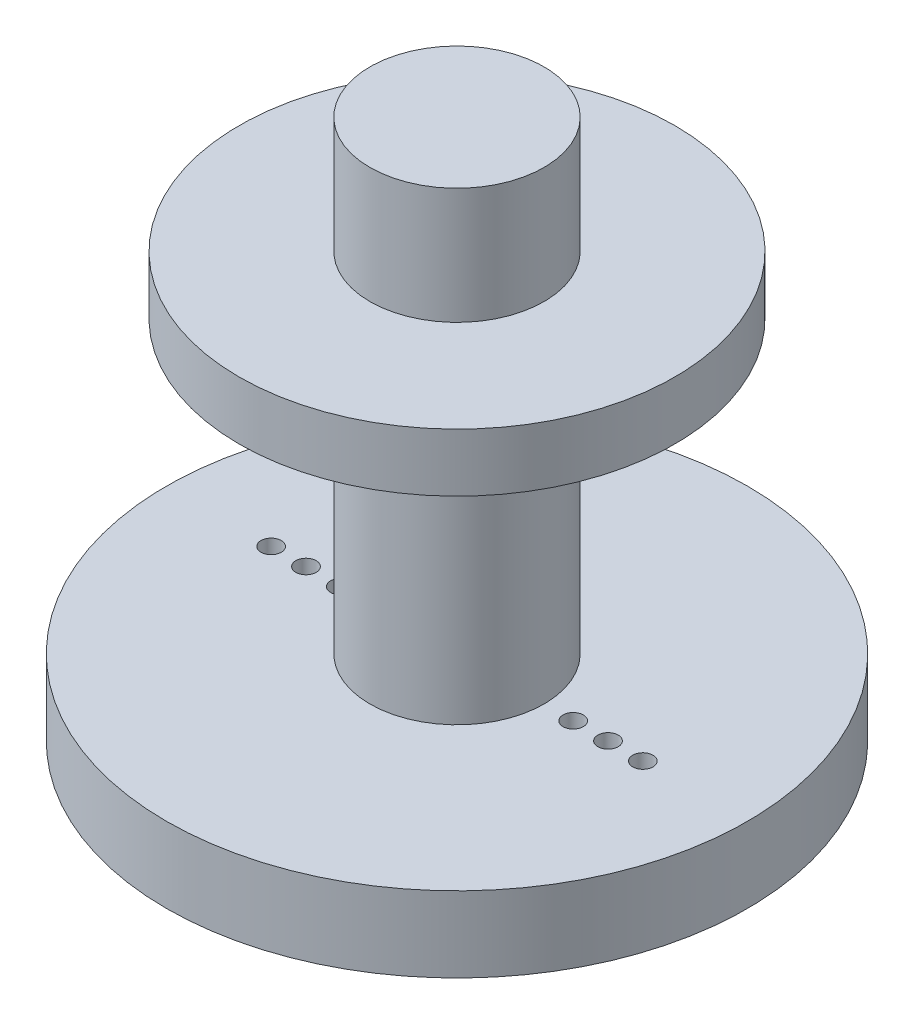
ISO-10303-21;
HEADER;
FILE_DESCRIPTION(('STEP AP214'),'2;1');
FILE_NAME('part.step','',(''),(''),'','','');
FILE_SCHEMA(('AUTOMOTIVE_DESIGN { 1 0 10303 214 1 1 1 1 }'));
ENDSEC;
DATA;
#1=APPLICATION_CONTEXT('core data for automotive mechanical design processes');
#2=APPLICATION_PROTOCOL_DEFINITION('international standard','automotive_design',2000,#1);
#3=PRODUCT_CONTEXT('',#1,'mechanical');
#4=PRODUCT('Part','Part','',(#3));
#5=PRODUCT_RELATED_PRODUCT_CATEGORY('part','',(#4));
#6=PRODUCT_DEFINITION_FORMATION('','',#4);
#7=PRODUCT_DEFINITION_CONTEXT('part definition',#1,'design');
#8=PRODUCT_DEFINITION('design','',#6,#7);
#9=PRODUCT_DEFINITION_SHAPE('','',#8);
#10=(LENGTH_UNIT() NAMED_UNIT(*) SI_UNIT(.MILLI.,.METRE.));
#11=(NAMED_UNIT(*) PLANE_ANGLE_UNIT() SI_UNIT($,.RADIAN.));
#12=(NAMED_UNIT(*) SI_UNIT($,.STERADIAN.) SOLID_ANGLE_UNIT());
#13=UNCERTAINTY_MEASURE_WITH_UNIT(LENGTH_MEASURE(1.E-05),#10,'distance_accuracy_value','');
#14=(GEOMETRIC_REPRESENTATION_CONTEXT(3) GLOBAL_UNCERTAINTY_ASSIGNED_CONTEXT((#13)) GLOBAL_UNIT_ASSIGNED_CONTEXT((#10,
#11,#12)) REPRESENTATION_CONTEXT('',''));
#15=CARTESIAN_POINT('',(0.,0.,0.));
#16=DIRECTION('',(0.,0.,1.));
#17=DIRECTION('',(1.,0.,0.));
#18=AXIS2_PLACEMENT_3D('',#15,#16,#17);
#19=CARTESIAN_POINT('',(0.,6.5,0.));
#20=DIRECTION('',(0.,-1.,0.));
#21=DIRECTION('',(0.,0.,-1.));
#22=AXIS2_PLACEMENT_3D('',#19,#20,#21);
#23=CYLINDRICAL_SURFACE('',#22,25.);
#24=CARTESIAN_POINT('',(0.,6.5,0.));
#25=DIRECTION('',(0.,1.,0.));
#26=DIRECTION('',(0.,0.,1.));
#27=AXIS2_PLACEMENT_3D('',#24,#25,#26);
#28=CIRCLE('',#27,25.);
#29=CARTESIAN_POINT('',(0.,6.5,-25.));
#30=VERTEX_POINT('',#29);
#31=EDGE_CURVE('E46',#30,#30,#28,.T.);
#32=CARTESIAN_POINT('',(0.,0.,0.));
#33=DIRECTION('',(0.,1.,0.));
#34=DIRECTION('',(0.,0.,1.));
#35=AXIS2_PLACEMENT_3D('',#32,#33,#34);
#36=CIRCLE('',#35,25.);
#37=CARTESIAN_POINT('',(0.,0.,-25.));
#38=VERTEX_POINT('',#37);
#39=EDGE_CURVE('E41',#38,#38,#36,.T.);
#40=CARTESIAN_POINT('',(0.,6.5,-25.));
#41=CARTESIAN_POINT('',(0.,6.43229166666667,-25.));
#42=CARTESIAN_POINT('',(0.,6.36458333333333,-25.));
#43=CARTESIAN_POINT('',(0.,6.22916666666667,-25.));
#44=CARTESIAN_POINT('',(0.,6.16145833333333,-25.));
#45=CARTESIAN_POINT('',(0.,6.02604166666667,-25.));
#46=CARTESIAN_POINT('',(0.,5.95833333333333,-25.));
#47=CARTESIAN_POINT('',(0.,5.82291666666667,-25.));
#48=CARTESIAN_POINT('',(0.,5.75520833333333,-25.));
#49=CARTESIAN_POINT('',(0.,5.61979166666667,-25.));
#50=CARTESIAN_POINT('',(0.,5.55208333333333,-25.));
#51=CARTESIAN_POINT('',(0.,5.41666666666667,-25.));
#52=CARTESIAN_POINT('',(0.,5.34895833333333,-25.));
#53=CARTESIAN_POINT('',(0.,5.21354166666667,-25.));
#54=CARTESIAN_POINT('',(0.,5.14583333333333,-25.));
#55=CARTESIAN_POINT('',(0.,5.01041666666667,-25.));
#56=CARTESIAN_POINT('',(0.,4.94270833333333,-25.));
#57=CARTESIAN_POINT('',(0.,4.80729166666667,-25.));
#58=CARTESIAN_POINT('',(0.,4.73958333333333,-25.));
#59=CARTESIAN_POINT('',(0.,4.60416666666667,-25.));
#60=CARTESIAN_POINT('',(0.,4.53645833333333,-25.));
#61=CARTESIAN_POINT('',(0.,4.40104166666667,-25.));
#62=CARTESIAN_POINT('',(0.,4.33333333333333,-25.));
#63=CARTESIAN_POINT('',(0.,4.19791666666667,-25.));
#64=CARTESIAN_POINT('',(0.,4.13020833333333,-25.));
#65=CARTESIAN_POINT('',(0.,3.99479166666667,-25.));
#66=CARTESIAN_POINT('',(0.,3.92708333333333,-25.));
#67=CARTESIAN_POINT('',(0.,3.79166666666667,-25.));
#68=CARTESIAN_POINT('',(0.,3.72395833333333,-25.));
#69=CARTESIAN_POINT('',(0.,3.58854166666667,-25.));
#70=CARTESIAN_POINT('',(0.,3.52083333333333,-25.));
#71=CARTESIAN_POINT('',(0.,3.38541666666667,-25.));
#72=CARTESIAN_POINT('',(0.,3.31770833333333,-25.));
#73=CARTESIAN_POINT('',(0.,3.18229166666667,-25.));
#74=CARTESIAN_POINT('',(0.,3.11458333333333,-25.));
#75=CARTESIAN_POINT('',(0.,2.97916666666667,-25.));
#76=CARTESIAN_POINT('',(0.,2.91145833333333,-25.));
#77=CARTESIAN_POINT('',(0.,2.77604166666667,-25.));
#78=CARTESIAN_POINT('',(0.,2.70833333333333,-25.));
#79=CARTESIAN_POINT('',(0.,2.57291666666667,-25.));
#80=CARTESIAN_POINT('',(0.,2.50520833333333,-25.));
#81=CARTESIAN_POINT('',(0.,2.36979166666667,-25.));
#82=CARTESIAN_POINT('',(0.,2.30208333333333,-25.));
#83=CARTESIAN_POINT('',(0.,2.16666666666667,-25.));
#84=CARTESIAN_POINT('',(0.,2.09895833333333,-25.));
#85=CARTESIAN_POINT('',(0.,1.96354166666667,-25.));
#86=CARTESIAN_POINT('',(0.,1.89583333333333,-25.));
#87=CARTESIAN_POINT('',(0.,1.76041666666667,-25.));
#88=CARTESIAN_POINT('',(0.,1.69270833333333,-25.));
#89=CARTESIAN_POINT('',(0.,1.55729166666667,-25.));
#90=CARTESIAN_POINT('',(0.,1.48958333333333,-25.));
#91=CARTESIAN_POINT('',(0.,1.35416666666667,-25.));
#92=CARTESIAN_POINT('',(0.,1.28645833333333,-25.));
#93=CARTESIAN_POINT('',(0.,1.15104166666667,-25.));
#94=CARTESIAN_POINT('',(0.,1.08333333333333,-25.));
#95=CARTESIAN_POINT('',(0.,0.947916666666667,-25.));
#96=CARTESIAN_POINT('',(0.,0.880208333333333,-25.));
#97=CARTESIAN_POINT('',(0.,0.744791666666667,-25.));
#98=CARTESIAN_POINT('',(0.,0.677083333333333,-25.));
#99=CARTESIAN_POINT('',(0.,0.541666666666667,-25.));
#100=CARTESIAN_POINT('',(0.,0.473958333333333,-25.));
#101=CARTESIAN_POINT('',(0.,0.338541666666667,-25.));
#102=CARTESIAN_POINT('',(0.,0.270833333333334,-25.));
#103=CARTESIAN_POINT('',(0.,0.135416666666667,-25.));
#104=CARTESIAN_POINT('',(0.,0.0677083333333334,-25.));
#105=CARTESIAN_POINT('',(0.,0.,-25.));
#106=B_SPLINE_CURVE_WITH_KNOTS('',3,(#40,#41,#42,#43,#44,#45,#46,#47,#48,#49,#50,#51,#52,#53,
#54,#55,#56,#57,#58,#59,#60,#61,#62,#63,#64,#65,#66,#67,#68,#69,#70,#71,#72,#73,#74,#75,#76,#77,
#78,#79,#80,#81,#82,#83,#84,#85,#86,#87,#88,#89,#90,#91,#92,#93,#94,#95,#96,#97,#98,#99,#100,
#101,#102,#103,#104,#105),.UNSPECIFIED.,.F.,.F.,(4,2,2,2,2,2,2,2,2,2,2,2,2,2,2,2,2,2,2,2,2,2,2,
2,2,2,2,2,2,2,2,2,4),(0.,0.203125,0.40625,0.609375000000001,0.812500000000001,1.015625,1.21875,
1.421875,1.625,1.828125,2.03125,2.234375,2.4375,2.640625,2.84375,3.046875,3.25,3.453125,3.65625,
3.859375,4.0625,4.265625,4.46875,4.671875,4.875,5.078125,5.28125,5.484375,5.6875,5.890625,
6.09375,6.296875,6.5),.UNSPECIFIED.);
#107=EDGE_CURVE('BSEAM38',#30,#38,#106,.T.);
#108=ORIENTED_EDGE('',*,*,#31,.F.);
#109=ORIENTED_EDGE('',*,*,#39,.T.);
#110=ORIENTED_EDGE('',*,*,#107,.T.);
#111=ORIENTED_EDGE('',*,*,#107,.F.);
#112=EDGE_LOOP('',(#108,#110,#109,#111));
#113=FACE_BOUND('',#112,.T.);
#114=ADVANCED_FACE('F38',(#113),#23,.T.);
#115=CARTESIAN_POINT('',(0.,6.5,0.));
#116=DIRECTION('',(0.,1.,0.));
#117=DIRECTION('',(0.,0.,1.));
#118=AXIS2_PLACEMENT_3D('',#115,#116,#117);
#119=PLANE('',#118);
#120=CARTESIAN_POINT('',(0.,6.5,0.));
#121=DIRECTION('',(0.,1.,0.));
#122=DIRECTION('',(0.,0.,1.));
#123=AXIS2_PLACEMENT_3D('',#120,#121,#122);
#124=CIRCLE('',#123,7.5);
#125=CARTESIAN_POINT('',(0.,6.5,7.5));
#126=VERTEX_POINT('',#125);
#127=EDGE_CURVE('E506',#126,#126,#124,.T.);
#128=ORIENTED_EDGE('',*,*,#127,.F.);
#129=EDGE_LOOP('',(#128));
#130=FACE_BOUND('',#129,.T.);
#131=CARTESIAN_POINT('',(-16.,6.5,0.));
#132=DIRECTION('',(0.,1.,0.));
#133=DIRECTION('',(0.,0.,1.));
#134=AXIS2_PLACEMENT_3D('',#131,#132,#133);
#135=CIRCLE('',#134,0.875);
#136=CARTESIAN_POINT('',(-16.,6.5,0.875));
#137=VERTEX_POINT('',#136);
#138=EDGE_CURVE('E476',#137,#137,#135,.F.);
#139=ORIENTED_EDGE('',*,*,#138,.T.);
#140=EDGE_LOOP('',(#139));
#141=FACE_BOUND('',#140,.T.);
#142=CARTESIAN_POINT('',(-13.,6.5,0.));
#143=DIRECTION('',(0.,1.,0.));
#144=DIRECTION('',(0.,0.,1.));
#145=AXIS2_PLACEMENT_3D('',#142,#143,#144);
#146=CIRCLE('',#145,0.875);
#147=CARTESIAN_POINT('',(-13.,6.5,0.875));
#148=VERTEX_POINT('',#147);
#149=EDGE_CURVE('E483',#148,#148,#146,.F.);
#150=ORIENTED_EDGE('',*,*,#149,.T.);
#151=EDGE_LOOP('',(#150));
#152=FACE_BOUND('',#151,.T.);
#153=CARTESIAN_POINT('',(-10.,6.5,0.));
#154=DIRECTION('',(0.,1.,0.));
#155=DIRECTION('',(0.,0.,1.));
#156=AXIS2_PLACEMENT_3D('',#153,#154,#155);
#157=CIRCLE('',#156,0.875);
#158=CARTESIAN_POINT('',(-10.,6.5,0.875));
#159=VERTEX_POINT('',#158);
#160=EDGE_CURVE('E489',#159,#159,#157,.F.);
#161=ORIENTED_EDGE('',*,*,#160,.T.);
#162=EDGE_LOOP('',(#161));
#163=FACE_BOUND('',#162,.T.);
#164=CARTESIAN_POINT('',(16.,6.5,0.));
#165=DIRECTION('',(0.,1.,0.));
#166=DIRECTION('',(0.,0.,1.));
#167=AXIS2_PLACEMENT_3D('',#164,#165,#166);
#168=CIRCLE('',#167,0.875000000000002);
#169=CARTESIAN_POINT('',(16.,6.5,0.875000000000002));
#170=VERTEX_POINT('',#169);
#171=EDGE_CURVE('E495',#170,#170,#168,.F.);
#172=ORIENTED_EDGE('',*,*,#171,.T.);
#173=EDGE_LOOP('',(#172));
#174=FACE_BOUND('',#173,.T.);
#175=CARTESIAN_POINT('',(13.,6.5,0.));
#176=DIRECTION('',(0.,1.,0.));
#177=DIRECTION('',(0.,0.,1.));
#178=AXIS2_PLACEMENT_3D('',#175,#176,#177);
#179=CIRCLE('',#178,0.875);
#180=CARTESIAN_POINT('',(13.,6.5,0.875));
#181=VERTEX_POINT('',#180);
#182=EDGE_CURVE('E501',#181,#181,#179,.F.);
#183=ORIENTED_EDGE('',*,*,#182,.T.);
#184=EDGE_LOOP('',(#183));
#185=FACE_BOUND('',#184,.T.);
#186=CARTESIAN_POINT('',(10.,6.5,0.));
#187=DIRECTION('',(0.,1.,0.));
#188=DIRECTION('',(0.,0.,1.));
#189=AXIS2_PLACEMENT_3D('',#186,#187,#188);
#190=CIRCLE('',#189,0.875);
#191=CARTESIAN_POINT('',(10.,6.5,0.875));
#192=VERTEX_POINT('',#191);
#193=EDGE_CURVE('E470',#192,#192,#190,.F.);
#194=ORIENTED_EDGE('',*,*,#193,.T.);
#195=EDGE_LOOP('',(#194));
#196=FACE_BOUND('',#195,.T.);
#197=ORIENTED_EDGE('',*,*,#31,.T.);
#198=EDGE_LOOP('',(#197));
#199=FACE_BOUND('',#198,.T.);
#200=ADVANCED_FACE('F244',(#130,#141,#152,#163,#174,#185,#196,#199),#119,.T.);
#201=CARTESIAN_POINT('',(0.,0.,0.));
#202=DIRECTION('',(0.,1.,0.));
#203=DIRECTION('',(0.,0.,1.));
#204=AXIS2_PLACEMENT_3D('',#201,#202,#203);
#205=PLANE('',#204);
#206=CARTESIAN_POINT('',(17.8847290850349,0.,-0.56107491716859));
#207=DIRECTION('',(0.,-1.,0.));
#208=DIRECTION('',(0.,0.,1.));
#209=AXIS2_PLACEMENT_3D('',#206,#207,#208);
#210=CIRCLE('',#209,3.11643938542762);
#211=CARTESIAN_POINT('',(21.,0.,-0.475742804709889));
#212=VERTEX_POINT('',#211);
#213=CARTESIAN_POINT('',(17.4455022656401,0.,2.52425719529011));
#214=VERTEX_POINT('',#213);
#215=EDGE_CURVE('E176',#212,#214,#210,.T.);
#216=ORIENTED_EDGE('',*,*,#215,.F.);
#217=CARTESIAN_POINT('',(18.0512468769501,0.,0.53274589743214));
#218=DIRECTION('',(0.,-1.,0.));
#219=DIRECTION('',(0.,0.,-1.));
#220=AXIS2_PLACEMENT_3D('',#217,#218,#219);
#221=CIRCLE('',#220,3.11643938542762);
#222=CARTESIAN_POINT('',(17.4455022656401,0.,-2.52425719529011));
#223=VERTEX_POINT('',#222);
#224=EDGE_CURVE('E54',#223,#212,#221,.T.);
#225=ORIENTED_EDGE('',*,*,#224,.F.);
#226=CARTESIAN_POINT('',(-5.20599883220902,0.,108.70856155673));
#227=DIRECTION('',(0.,-1.,0.));
#228=DIRECTION('',(0.,0.,-1.));
#229=AXIS2_PLACEMENT_3D('',#226,#227,#228);
#230=CIRCLE('',#229,113.51577189759);
#231=CARTESIAN_POINT('',(8.10347319825868,0.,-4.02425719529009));
#232=VERTEX_POINT('',#231);
#233=EDGE_CURVE('E210',#232,#223,#230,.T.);
#234=ORIENTED_EDGE('',*,*,#233,.F.);
#235=CARTESIAN_POINT('',(-3.64270437307683,0.,16.0686571908747));
#236=DIRECTION('',(0.,-1.,0.));
#237=DIRECTION('',(0.,0.,-1.));
#238=AXIS2_PLACEMENT_3D('',#235,#236,#237);
#239=CIRCLE('',#238,23.2744043117561);
#240=CARTESIAN_POINT('',(2.86783245125889,0.,-6.27660643088779));
#241=VERTEX_POINT('',#240);
#242=EDGE_CURVE('E208',#241,#232,#239,.T.);
#243=ORIENTED_EDGE('',*,*,#242,.F.);
#244=CARTESIAN_POINT('',(0.,0.,0.));
#245=DIRECTION('',(0.,-1.,0.));
#246=DIRECTION('',(0.,0.,-1.));
#247=AXIS2_PLACEMENT_3D('',#244,#245,#246);
#248=CIRCLE('',#247,6.90074280470991);
#249=CARTESIAN_POINT('',(-2.86783245125889,0.,-6.2766064308878));
#250=VERTEX_POINT('',#249);
#251=EDGE_CURVE('E150',#250,#241,#248,.T.);
#252=ORIENTED_EDGE('',*,*,#251,.F.);
#253=CARTESIAN_POINT('',(3.64270437307683,0.,16.0686571908747));
#254=DIRECTION('',(0.,-1.,0.));
#255=DIRECTION('',(0.,0.,1.));
#256=AXIS2_PLACEMENT_3D('',#253,#254,#255);
#257=CIRCLE('',#256,23.2744043117561);
#258=CARTESIAN_POINT('',(-8.10347319825866,0.,-4.02425719529009));
#259=VERTEX_POINT('',#258);
#260=EDGE_CURVE('E204',#259,#250,#257,.T.);
#261=ORIENTED_EDGE('',*,*,#260,.F.);
#262=CARTESIAN_POINT('',(-6.12655750670442,0.,109.474299068013));
#263=DIRECTION('',(0.,-1.,0.));
#264=DIRECTION('',(0.,0.,1.));
#265=AXIS2_PLACEMENT_3D('',#262,#263,#264);
#266=CIRCLE('',#265,113.51577189759);
#267=CARTESIAN_POINT('',(-17.4455022656401,0.,-3.47574280470989));
#268=VERTEX_POINT('',#267);
#269=EDGE_CURVE('E201',#268,#259,#266,.T.);
#270=ORIENTED_EDGE('',*,*,#269,.F.);
#271=CARTESIAN_POINT('',(-17.8847290850349,0.,-0.390410692251189));
#272=DIRECTION('',(0.,-1.,0.));
#273=DIRECTION('',(0.,0.,1.));
#274=AXIS2_PLACEMENT_3D('',#271,#272,#273);
#275=CIRCLE('',#274,3.11643938542762);
#276=CARTESIAN_POINT('',(-21.,0.,-0.475742804709896));
#277=VERTEX_POINT('',#276);
#278=EDGE_CURVE('E198',#277,#268,#275,.T.);
#279=ORIENTED_EDGE('',*,*,#278,.F.);
#280=CARTESIAN_POINT('',(-17.8847290850349,0.,-0.561074917168592));
#281=DIRECTION('',(0.,-1.,0.));
#282=DIRECTION('',(0.,0.,-1.));
#283=AXIS2_PLACEMENT_3D('',#280,#281,#282);
#284=CIRCLE('',#283,3.11643938542762);
#285=CARTESIAN_POINT('',(-17.4455022656401,0.,2.52425719529011));
#286=VERTEX_POINT('',#285);
#287=EDGE_CURVE('E195',#286,#277,#284,.T.);
#288=ORIENTED_EDGE('',*,*,#287,.F.);
#289=CARTESIAN_POINT('',(5.20599883220902,0.,-108.70856155673));
#290=DIRECTION('',(0.,-1.,0.));
#291=DIRECTION('',(0.,0.,-1.));
#292=AXIS2_PLACEMENT_3D('',#289,#290,#291);
#293=CIRCLE('',#292,113.51577189759);
#294=CARTESIAN_POINT('',(-8.10347319825867,0.,4.0242571952901));
#295=VERTEX_POINT('',#294);
#296=EDGE_CURVE('E192',#295,#286,#293,.T.);
#297=ORIENTED_EDGE('',*,*,#296,.F.);
#298=CARTESIAN_POINT('',(3.64270437307683,0.,-16.0686571908747));
#299=DIRECTION('',(0.,-1.,0.));
#300=DIRECTION('',(0.,0.,-1.));
#301=AXIS2_PLACEMENT_3D('',#298,#299,#300);
#302=CIRCLE('',#301,23.2744043117561);
#303=CARTESIAN_POINT('',(-2.86783245125889,0.,6.2766064308878));
#304=VERTEX_POINT('',#303);
#305=EDGE_CURVE('E189',#304,#295,#302,.T.);
#306=ORIENTED_EDGE('',*,*,#305,.F.);
#307=CARTESIAN_POINT('',(0.,0.,0.));
#308=DIRECTION('',(0.,-1.,0.));
#309=DIRECTION('',(0.,0.,-1.));
#310=AXIS2_PLACEMENT_3D('',#307,#308,#309);
#311=CIRCLE('',#310,6.90074280470991);
#312=CARTESIAN_POINT('',(2.86783245125889,0.,6.27660643088779));
#313=VERTEX_POINT('',#312);
#314=EDGE_CURVE('E186',#313,#304,#311,.T.);
#315=ORIENTED_EDGE('',*,*,#314,.F.);
#316=CARTESIAN_POINT('',(-3.64270437307683,0.,-16.0686571908747));
#317=DIRECTION('',(0.,-1.,0.));
#318=DIRECTION('',(0.,0.,1.));
#319=AXIS2_PLACEMENT_3D('',#316,#317,#318);
#320=CIRCLE('',#319,23.2744043117561);
#321=CARTESIAN_POINT('',(8.10347319825868,0.,4.02425719529009));
#322=VERTEX_POINT('',#321);
#323=EDGE_CURVE('E183',#322,#313,#320,.T.);
#324=ORIENTED_EDGE('',*,*,#323,.F.);
#325=CARTESIAN_POINT('',(-5.20599883220902,0.,-108.70856155673));
#326=DIRECTION('',(0.,-1.,0.));
#327=DIRECTION('',(0.,0.,1.));
#328=AXIS2_PLACEMENT_3D('',#325,#326,#327);
#329=CIRCLE('',#328,113.51577189759);
#330=EDGE_CURVE('E180',#214,#322,#329,.T.);
#331=ORIENTED_EDGE('',*,*,#330,.F.);
#332=EDGE_LOOP('',(#216,#225,#234,#243,#252,#261,#270,#279,#288,#297,#306,#315,#324,#331));
#333=FACE_BOUND('',#332,.T.);
#334=ORIENTED_EDGE('',*,*,#39,.F.);
#335=EDGE_LOOP('',(#334));
#336=FACE_BOUND('',#335,.T.);
#337=ADVANCED_FACE('F241',(#333,#336),#205,.F.);
#338=CARTESIAN_POINT('',(18.0512468769501,2.,0.53274589743214));
#339=DIRECTION('',(0.,-1.,0.));
#340=DIRECTION('',(0.,0.,-1.));
#341=AXIS2_PLACEMENT_3D('',#338,#339,#340);
#342=CYLINDRICAL_SURFACE('',#341,3.11643938542762);
#343=ORIENTED_EDGE('',*,*,#224,.T.);
#344=DIRECTION('',(0.,-1.,0.));
#345=VECTOR('',#344,1.);
#346=CARTESIAN_POINT('',(21.,2.,-0.475742804709889));
#347=LINE('',#346,#345);
#348=CARTESIAN_POINT('',(21.,2.,-0.475742804709889));
#349=VERTEX_POINT('',#348);
#350=EDGE_CURVE('E108',#349,#212,#347,.T.);
#351=ORIENTED_EDGE('',*,*,#350,.F.);
#352=CARTESIAN_POINT('',(18.0512468769501,2.,0.53274589743214));
#353=DIRECTION('',(0.,-1.,0.));
#354=DIRECTION('',(0.,0.,-1.));
#355=AXIS2_PLACEMENT_3D('',#352,#353,#354);
#356=CIRCLE('',#355,3.11643938542762);
#357=CARTESIAN_POINT('',(17.4455022656401,2.,-2.52425719529011));
#358=VERTEX_POINT('',#357);
#359=EDGE_CURVE('E212',#358,#349,#356,.T.);
#360=ORIENTED_EDGE('',*,*,#359,.F.);
#361=DIRECTION('',(0.,-1.,0.));
#362=VECTOR('',#361,1.);
#363=CARTESIAN_POINT('',(17.4455022656401,2.,-2.52425719529011));
#364=LINE('',#363,#362);
#365=EDGE_CURVE('E62',#358,#223,#364,.T.);
#366=ORIENTED_EDGE('',*,*,#365,.T.);
#367=EDGE_LOOP('',(#343,#351,#360,#366));
#368=FACE_BOUND('',#367,.T.);
#369=ADVANCED_FACE('F243',(#368),#342,.F.);
#370=CARTESIAN_POINT('',(-5.20599883220902,2.,108.70856155673));
#371=DIRECTION('',(0.,-1.,0.));
#372=DIRECTION('',(0.,0.,-1.));
#373=AXIS2_PLACEMENT_3D('',#370,#371,#372);
#374=CYLINDRICAL_SURFACE('',#373,113.51577189759);
#375=ORIENTED_EDGE('',*,*,#233,.T.);
#376=ORIENTED_EDGE('',*,*,#365,.F.);
#377=CARTESIAN_POINT('',(-5.20599883220902,2.,108.70856155673));
#378=DIRECTION('',(0.,-1.,0.));
#379=DIRECTION('',(0.,0.,-1.));
#380=AXIS2_PLACEMENT_3D('',#377,#378,#379);
#381=CIRCLE('',#380,113.51577189759);
#382=CARTESIAN_POINT('',(8.10347319825868,2.,-4.02425719529009));
#383=VERTEX_POINT('',#382);
#384=EDGE_CURVE('E162',#383,#358,#381,.T.);
#385=ORIENTED_EDGE('',*,*,#384,.F.);
#386=DIRECTION('',(0.,-1.,0.));
#387=VECTOR('',#386,1.);
#388=CARTESIAN_POINT('',(8.10347319825868,2.,-4.02425719529009));
#389=LINE('',#388,#387);
#390=EDGE_CURVE('E154',#383,#232,#389,.T.);
#391=ORIENTED_EDGE('',*,*,#390,.T.);
#392=EDGE_LOOP('',(#375,#376,#385,#391));
#393=FACE_BOUND('',#392,.T.);
#394=ADVANCED_FACE('F250',(#393),#374,.F.);
#395=CARTESIAN_POINT('',(-3.64270437307683,2.,16.0686571908747));
#396=DIRECTION('',(0.,-1.,0.));
#397=DIRECTION('',(0.,0.,-1.));
#398=AXIS2_PLACEMENT_3D('',#395,#396,#397);
#399=CYLINDRICAL_SURFACE('',#398,23.2744043117561);
#400=ORIENTED_EDGE('',*,*,#242,.T.);
#401=ORIENTED_EDGE('',*,*,#390,.F.);
#402=CARTESIAN_POINT('',(-3.64270437307683,2.,16.0686571908747));
#403=DIRECTION('',(0.,-1.,0.));
#404=DIRECTION('',(0.,0.,-1.));
#405=AXIS2_PLACEMENT_3D('',#402,#403,#404);
#406=CIRCLE('',#405,23.2744043117561);
#407=CARTESIAN_POINT('',(2.86783245125889,2.,-6.27660643088779));
#408=VERTEX_POINT('',#407);
#409=EDGE_CURVE('E158',#408,#383,#406,.T.);
#410=ORIENTED_EDGE('',*,*,#409,.F.);
#411=DIRECTION('',(0.,-1.,0.));
#412=VECTOR('',#411,1.);
#413=CARTESIAN_POINT('',(2.86783245125889,2.,-6.27660643088779));
#414=LINE('',#413,#412);
#415=EDGE_CURVE('E143',#408,#241,#414,.T.);
#416=ORIENTED_EDGE('',*,*,#415,.T.);
#417=EDGE_LOOP('',(#400,#401,#410,#416));
#418=FACE_BOUND('',#417,.T.);
#419=ADVANCED_FACE('F159',(#418),#399,.F.);
#420=CARTESIAN_POINT('',(0.,2.,0.));
#421=DIRECTION('',(0.,-1.,0.));
#422=DIRECTION('',(0.,0.,-1.));
#423=AXIS2_PLACEMENT_3D('',#420,#421,#422);
#424=CYLINDRICAL_SURFACE('',#423,6.90074280470991);
#425=ORIENTED_EDGE('',*,*,#251,.T.);
#426=ORIENTED_EDGE('',*,*,#415,.F.);
#427=CARTESIAN_POINT('',(0.,2.,0.));
#428=DIRECTION('',(0.,-1.,0.));
#429=DIRECTION('',(0.,0.,-1.));
#430=AXIS2_PLACEMENT_3D('',#427,#428,#429);
#431=CIRCLE('',#430,6.90074280470991);
#432=CARTESIAN_POINT('',(-2.86783245125889,2.,-6.2766064308878));
#433=VERTEX_POINT('',#432);
#434=EDGE_CURVE('E147',#433,#408,#431,.T.);
#435=ORIENTED_EDGE('',*,*,#434,.F.);
#436=DIRECTION('',(0.,-1.,0.));
#437=VECTOR('',#436,1.);
#438=CARTESIAN_POINT('',(-2.86783245125889,2.,-6.2766064308878));
#439=LINE('',#438,#437);
#440=EDGE_CURVE('E155',#433,#250,#439,.T.);
#441=ORIENTED_EDGE('',*,*,#440,.T.);
#442=EDGE_LOOP('',(#425,#426,#435,#441));
#443=FACE_BOUND('',#442,.T.);
#444=ADVANCED_FACE('F145',(#443),#424,.F.);
#445=CARTESIAN_POINT('',(3.64270437307683,2.,16.0686571908747));
#446=DIRECTION('',(0.,-1.,0.));
#447=DIRECTION('',(0.,0.,-1.));
#448=AXIS2_PLACEMENT_3D('',#445,#446,#447);
#449=CYLINDRICAL_SURFACE('',#448,23.2744043117561);
#450=ORIENTED_EDGE('',*,*,#260,.T.);
#451=ORIENTED_EDGE('',*,*,#440,.F.);
#452=CARTESIAN_POINT('',(3.64270437307683,2.,16.0686571908747));
#453=DIRECTION('',(0.,-1.,0.));
#454=DIRECTION('',(0.,0.,1.));
#455=AXIS2_PLACEMENT_3D('',#452,#453,#454);
#456=CIRCLE('',#455,23.2744043117561);
#457=CARTESIAN_POINT('',(-8.10347319825866,2.,-4.02425719529009));
#458=VERTEX_POINT('',#457);
#459=EDGE_CURVE('E168',#458,#433,#456,.T.);
#460=ORIENTED_EDGE('',*,*,#459,.F.);
#461=DIRECTION('',(0.,-1.,0.));
#462=VECTOR('',#461,1.);
#463=CARTESIAN_POINT('',(-8.10347319825866,2.,-4.02425719529009));
#464=LINE('',#463,#462);
#465=EDGE_CURVE('E216',#458,#259,#464,.T.);
#466=ORIENTED_EDGE('',*,*,#465,.T.);
#467=EDGE_LOOP('',(#450,#451,#460,#466));
#468=FACE_BOUND('',#467,.T.);
#469=ADVANCED_FACE('F387',(#468),#449,.F.);
#470=CARTESIAN_POINT('',(-6.12655750670442,2.,109.474299068013));
#471=DIRECTION('',(0.,-1.,0.));
#472=DIRECTION('',(0.,0.,-1.));
#473=AXIS2_PLACEMENT_3D('',#470,#471,#472);
#474=CYLINDRICAL_SURFACE('',#473,113.51577189759);
#475=ORIENTED_EDGE('',*,*,#269,.T.);
#476=ORIENTED_EDGE('',*,*,#465,.F.);
#477=CARTESIAN_POINT('',(-6.12655750670442,2.,109.474299068013));
#478=DIRECTION('',(0.,-1.,0.));
#479=DIRECTION('',(0.,0.,1.));
#480=AXIS2_PLACEMENT_3D('',#477,#478,#479);
#481=CIRCLE('',#480,113.51577189759);
#482=CARTESIAN_POINT('',(-17.4455022656401,2.,-3.47574280470989));
#483=VERTEX_POINT('',#482);
#484=EDGE_CURVE('E170',#483,#458,#481,.T.);
#485=ORIENTED_EDGE('',*,*,#484,.F.);
#486=DIRECTION('',(0.,-1.,0.));
#487=VECTOR('',#486,1.);
#488=CARTESIAN_POINT('',(-17.4455022656401,2.,-3.47574280470989));
#489=LINE('',#488,#487);
#490=EDGE_CURVE('E218',#483,#268,#489,.T.);
#491=ORIENTED_EDGE('',*,*,#490,.T.);
#492=EDGE_LOOP('',(#475,#476,#485,#491));
#493=FACE_BOUND('',#492,.T.);
#494=ADVANCED_FACE('F390',(#493),#474,.F.);
#495=CARTESIAN_POINT('',(-17.8847290850349,2.,-0.390410692251189));
#496=DIRECTION('',(0.,-1.,0.));
#497=DIRECTION('',(0.,0.,-1.));
#498=AXIS2_PLACEMENT_3D('',#495,#496,#497);
#499=CYLINDRICAL_SURFACE('',#498,3.11643938542762);
#500=ORIENTED_EDGE('',*,*,#278,.T.);
#501=ORIENTED_EDGE('',*,*,#490,.F.);
#502=CARTESIAN_POINT('',(-17.8847290850349,2.,-0.390410692251189));
#503=DIRECTION('',(0.,-1.,0.));
#504=DIRECTION('',(0.,0.,1.));
#505=AXIS2_PLACEMENT_3D('',#502,#503,#504);
#506=CIRCLE('',#505,3.11643938542762);
#507=CARTESIAN_POINT('',(-21.,2.,-0.475742804709896));
#508=VERTEX_POINT('',#507);
#509=EDGE_CURVE('E455',#508,#483,#506,.T.);
#510=ORIENTED_EDGE('',*,*,#509,.F.);
#511=DIRECTION('',(0.,-1.,0.));
#512=VECTOR('',#511,1.);
#513=CARTESIAN_POINT('',(-21.,2.,-0.475742804709896));
#514=LINE('',#513,#512);
#515=EDGE_CURVE('E220',#508,#277,#514,.T.);
#516=ORIENTED_EDGE('',*,*,#515,.T.);
#517=EDGE_LOOP('',(#500,#501,#510,#516));
#518=FACE_BOUND('',#517,.T.);
#519=ADVANCED_FACE('F394',(#518),#499,.F.);
#520=CARTESIAN_POINT('',(-17.8847290850349,2.,-0.561074917168592));
#521=DIRECTION('',(0.,-1.,0.));
#522=DIRECTION('',(0.,0.,-1.));
#523=AXIS2_PLACEMENT_3D('',#520,#521,#522);
#524=CYLINDRICAL_SURFACE('',#523,3.11643938542762);
#525=ORIENTED_EDGE('',*,*,#287,.T.);
#526=ORIENTED_EDGE('',*,*,#515,.F.);
#527=CARTESIAN_POINT('',(-17.8847290850349,2.,-0.561074917168592));
#528=DIRECTION('',(0.,-1.,0.));
#529=DIRECTION('',(0.,0.,-1.));
#530=AXIS2_PLACEMENT_3D('',#527,#528,#529);
#531=CIRCLE('',#530,3.11643938542762);
#532=CARTESIAN_POINT('',(-17.4455022656401,2.,2.52425719529011));
#533=VERTEX_POINT('',#532);
#534=EDGE_CURVE('E452',#533,#508,#531,.T.);
#535=ORIENTED_EDGE('',*,*,#534,.F.);
#536=DIRECTION('',(0.,-1.,0.));
#537=VECTOR('',#536,1.);
#538=CARTESIAN_POINT('',(-17.4455022656401,2.,2.52425719529011));
#539=LINE('',#538,#537);
#540=EDGE_CURVE('E222',#533,#286,#539,.T.);
#541=ORIENTED_EDGE('',*,*,#540,.T.);
#542=EDGE_LOOP('',(#525,#526,#535,#541));
#543=FACE_BOUND('',#542,.T.);
#544=ADVANCED_FACE('F398',(#543),#524,.F.);
#545=CARTESIAN_POINT('',(5.20599883220902,2.,-108.70856155673));
#546=DIRECTION('',(0.,-1.,0.));
#547=DIRECTION('',(0.,0.,-1.));
#548=AXIS2_PLACEMENT_3D('',#545,#546,#547);
#549=CYLINDRICAL_SURFACE('',#548,113.51577189759);
#550=ORIENTED_EDGE('',*,*,#296,.T.);
#551=ORIENTED_EDGE('',*,*,#540,.F.);
#552=CARTESIAN_POINT('',(5.20599883220902,2.,-108.70856155673));
#553=DIRECTION('',(0.,-1.,0.));
#554=DIRECTION('',(0.,0.,-1.));
#555=AXIS2_PLACEMENT_3D('',#552,#553,#554);
#556=CIRCLE('',#555,113.51577189759);
#557=CARTESIAN_POINT('',(-8.10347319825867,2.,4.0242571952901));
#558=VERTEX_POINT('',#557);
#559=EDGE_CURVE('E449',#558,#533,#556,.T.);
#560=ORIENTED_EDGE('',*,*,#559,.F.);
#561=DIRECTION('',(0.,-1.,0.));
#562=VECTOR('',#561,1.);
#563=CARTESIAN_POINT('',(-8.10347319825867,2.,4.0242571952901));
#564=LINE('',#563,#562);
#565=EDGE_CURVE('E224',#558,#295,#564,.T.);
#566=ORIENTED_EDGE('',*,*,#565,.T.);
#567=EDGE_LOOP('',(#550,#551,#560,#566));
#568=FACE_BOUND('',#567,.T.);
#569=ADVANCED_FACE('F402',(#568),#549,.F.);
#570=CARTESIAN_POINT('',(3.64270437307683,2.,-16.0686571908747));
#571=DIRECTION('',(0.,-1.,0.));
#572=DIRECTION('',(0.,0.,-1.));
#573=AXIS2_PLACEMENT_3D('',#570,#571,#572);
#574=CYLINDRICAL_SURFACE('',#573,23.2744043117561);
#575=ORIENTED_EDGE('',*,*,#305,.T.);
#576=ORIENTED_EDGE('',*,*,#565,.F.);
#577=CARTESIAN_POINT('',(3.64270437307683,2.,-16.0686571908747));
#578=DIRECTION('',(0.,-1.,0.));
#579=DIRECTION('',(0.,0.,-1.));
#580=AXIS2_PLACEMENT_3D('',#577,#578,#579);
#581=CIRCLE('',#580,23.2744043117561);
#582=CARTESIAN_POINT('',(-2.86783245125889,2.,6.2766064308878));
#583=VERTEX_POINT('',#582);
#584=EDGE_CURVE('E446',#583,#558,#581,.T.);
#585=ORIENTED_EDGE('',*,*,#584,.F.);
#586=DIRECTION('',(0.,-1.,0.));
#587=VECTOR('',#586,1.);
#588=CARTESIAN_POINT('',(-2.86783245125889,2.,6.2766064308878));
#589=LINE('',#588,#587);
#590=EDGE_CURVE('E226',#583,#304,#589,.T.);
#591=ORIENTED_EDGE('',*,*,#590,.T.);
#592=EDGE_LOOP('',(#575,#576,#585,#591));
#593=FACE_BOUND('',#592,.T.);
#594=ADVANCED_FACE('F406',(#593),#574,.F.);
#595=CARTESIAN_POINT('',(0.,2.,0.));
#596=DIRECTION('',(0.,-1.,0.));
#597=DIRECTION('',(0.,0.,-1.));
#598=AXIS2_PLACEMENT_3D('',#595,#596,#597);
#599=CYLINDRICAL_SURFACE('',#598,6.90074280470991);
#600=ORIENTED_EDGE('',*,*,#314,.T.);
#601=ORIENTED_EDGE('',*,*,#590,.F.);
#602=CARTESIAN_POINT('',(0.,2.,0.));
#603=DIRECTION('',(0.,-1.,0.));
#604=DIRECTION('',(0.,0.,-1.));
#605=AXIS2_PLACEMENT_3D('',#602,#603,#604);
#606=CIRCLE('',#605,6.90074280470991);
#607=CARTESIAN_POINT('',(2.86783245125889,2.,6.27660643088779));
#608=VERTEX_POINT('',#607);
#609=EDGE_CURVE('E443',#608,#583,#606,.T.);
#610=ORIENTED_EDGE('',*,*,#609,.F.);
#611=DIRECTION('',(0.,-1.,0.));
#612=VECTOR('',#611,1.);
#613=CARTESIAN_POINT('',(2.86783245125889,2.,6.27660643088779));
#614=LINE('',#613,#612);
#615=EDGE_CURVE('E228',#608,#313,#614,.T.);
#616=ORIENTED_EDGE('',*,*,#615,.T.);
#617=EDGE_LOOP('',(#600,#601,#610,#616));
#618=FACE_BOUND('',#617,.T.);
#619=ADVANCED_FACE('F410',(#618),#599,.F.);
#620=CARTESIAN_POINT('',(-3.64270437307683,2.,-16.0686571908747));
#621=DIRECTION('',(0.,-1.,0.));
#622=DIRECTION('',(0.,0.,-1.));
#623=AXIS2_PLACEMENT_3D('',#620,#621,#622);
#624=CYLINDRICAL_SURFACE('',#623,23.2744043117561);
#625=ORIENTED_EDGE('',*,*,#323,.T.);
#626=ORIENTED_EDGE('',*,*,#615,.F.);
#627=CARTESIAN_POINT('',(-3.64270437307683,2.,-16.0686571908747));
#628=DIRECTION('',(0.,-1.,0.));
#629=DIRECTION('',(0.,0.,1.));
#630=AXIS2_PLACEMENT_3D('',#627,#628,#629);
#631=CIRCLE('',#630,23.2744043117561);
#632=CARTESIAN_POINT('',(8.10347319825868,2.,4.02425719529009));
#633=VERTEX_POINT('',#632);
#634=EDGE_CURVE('E435',#633,#608,#631,.T.);
#635=ORIENTED_EDGE('',*,*,#634,.F.);
#636=DIRECTION('',(0.,-1.,0.));
#637=VECTOR('',#636,1.);
#638=CARTESIAN_POINT('',(8.10347319825868,2.,4.02425719529009));
#639=LINE('',#638,#637);
#640=EDGE_CURVE('E230',#633,#322,#639,.T.);
#641=ORIENTED_EDGE('',*,*,#640,.T.);
#642=EDGE_LOOP('',(#625,#626,#635,#641));
#643=FACE_BOUND('',#642,.T.);
#644=ADVANCED_FACE('F414',(#643),#624,.F.);
#645=CARTESIAN_POINT('',(-5.20599883220902,2.,-108.70856155673));
#646=DIRECTION('',(0.,-1.,0.));
#647=DIRECTION('',(0.,0.,-1.));
#648=AXIS2_PLACEMENT_3D('',#645,#646,#647);
#649=CYLINDRICAL_SURFACE('',#648,113.51577189759);
#650=ORIENTED_EDGE('',*,*,#330,.T.);
#651=ORIENTED_EDGE('',*,*,#640,.F.);
#652=CARTESIAN_POINT('',(-5.20599883220902,2.,-108.70856155673));
#653=DIRECTION('',(0.,-1.,0.));
#654=DIRECTION('',(0.,0.,1.));
#655=AXIS2_PLACEMENT_3D('',#652,#653,#654);
#656=CIRCLE('',#655,113.51577189759);
#657=CARTESIAN_POINT('',(17.4455022656401,2.,2.52425719529011));
#658=VERTEX_POINT('',#657);
#659=EDGE_CURVE('E432',#658,#633,#656,.T.);
#660=ORIENTED_EDGE('',*,*,#659,.F.);
#661=DIRECTION('',(0.,-1.,0.));
#662=VECTOR('',#661,1.);
#663=CARTESIAN_POINT('',(17.4455022656401,2.,2.52425719529011));
#664=LINE('',#663,#662);
#665=EDGE_CURVE('E232',#658,#214,#664,.T.);
#666=ORIENTED_EDGE('',*,*,#665,.T.);
#667=EDGE_LOOP('',(#650,#651,#660,#666));
#668=FACE_BOUND('',#667,.T.);
#669=ADVANCED_FACE('F418',(#668),#649,.F.);
#670=CARTESIAN_POINT('',(17.8847290850349,2.,-0.56107491716859));
#671=DIRECTION('',(0.,-1.,0.));
#672=DIRECTION('',(0.,0.,-1.));
#673=AXIS2_PLACEMENT_3D('',#670,#671,#672);
#674=CYLINDRICAL_SURFACE('',#673,3.11643938542762);
#675=ORIENTED_EDGE('',*,*,#215,.T.);
#676=ORIENTED_EDGE('',*,*,#665,.F.);
#677=CARTESIAN_POINT('',(17.8847290850349,2.,-0.56107491716859));
#678=DIRECTION('',(0.,-1.,0.));
#679=DIRECTION('',(0.,0.,1.));
#680=AXIS2_PLACEMENT_3D('',#677,#678,#679);
#681=CIRCLE('',#680,3.11643938542762);
#682=EDGE_CURVE('E436',#349,#658,#681,.T.);
#683=ORIENTED_EDGE('',*,*,#682,.F.);
#684=ORIENTED_EDGE('',*,*,#350,.T.);
#685=EDGE_LOOP('',(#675,#676,#683,#684));
#686=FACE_BOUND('',#685,.T.);
#687=ADVANCED_FACE('F316',(#686),#674,.F.);
#688=CARTESIAN_POINT('',(17.9679879809925,2.,-0.0141645098682252));
#689=DIRECTION('',(0.,-1.,0.));
#690=DIRECTION('',(0.,0.,-1.));
#691=AXIS2_PLACEMENT_3D('',#688,#689,#690);
#692=PLANE('',#691);
#693=CARTESIAN_POINT('',(0.,2.,0.));
#694=DIRECTION('',(0.,1.,0.));
#695=DIRECTION('',(0.,0.,-1.));
#696=AXIS2_PLACEMENT_3D('',#693,#694,#695);
#697=CIRCLE('',#696,3.4);
#698=CARTESIAN_POINT('',(0.,2.00000000000002,-3.4));
#699=VERTEX_POINT('',#698);
#700=EDGE_CURVE('E515',#699,#699,#697,.T.);
#701=ORIENTED_EDGE('',*,*,#700,.T.);
#702=EDGE_LOOP('',(#701));
#703=FACE_BOUND('',#702,.T.);
#704=CARTESIAN_POINT('',(-16.,2.,0.));
#705=DIRECTION('',(0.,-1.,0.));
#706=DIRECTION('',(0.,0.,1.));
#707=AXIS2_PLACEMENT_3D('',#704,#705,#706);
#708=CIRCLE('',#707,0.875);
#709=CARTESIAN_POINT('',(-16.,2.,0.875));
#710=VERTEX_POINT('',#709);
#711=EDGE_CURVE('E479',#710,#710,#708,.T.);
#712=ORIENTED_EDGE('',*,*,#711,.F.);
#713=EDGE_LOOP('',(#712));
#714=FACE_BOUND('',#713,.T.);
#715=CARTESIAN_POINT('',(-13.,2.,0.));
#716=DIRECTION('',(0.,-1.,0.));
#717=DIRECTION('',(0.,0.,1.));
#718=AXIS2_PLACEMENT_3D('',#715,#716,#717);
#719=CIRCLE('',#718,0.875);
#720=CARTESIAN_POINT('',(-13.,2.,0.875));
#721=VERTEX_POINT('',#720);
#722=EDGE_CURVE('E486',#721,#721,#719,.T.);
#723=ORIENTED_EDGE('',*,*,#722,.F.);
#724=EDGE_LOOP('',(#723));
#725=FACE_BOUND('',#724,.T.);
#726=CARTESIAN_POINT('',(-10.,2.,0.));
#727=DIRECTION('',(0.,-1.,0.));
#728=DIRECTION('',(0.,0.,1.));
#729=AXIS2_PLACEMENT_3D('',#726,#727,#728);
#730=CIRCLE('',#729,0.875);
#731=CARTESIAN_POINT('',(-10.,2.,0.875));
#732=VERTEX_POINT('',#731);
#733=EDGE_CURVE('E492',#732,#732,#730,.T.);
#734=ORIENTED_EDGE('',*,*,#733,.F.);
#735=EDGE_LOOP('',(#734));
#736=FACE_BOUND('',#735,.T.);
#737=CARTESIAN_POINT('',(16.,2.,0.));
#738=DIRECTION('',(0.,-1.,0.));
#739=DIRECTION('',(0.,0.,-1.));
#740=AXIS2_PLACEMENT_3D('',#737,#738,#739);
#741=CIRCLE('',#740,0.875000000000002);
#742=CARTESIAN_POINT('',(16.,2.,-0.875000000000002));
#743=VERTEX_POINT('',#742);
#744=EDGE_CURVE('E498',#743,#743,#741,.T.);
#745=ORIENTED_EDGE('',*,*,#744,.F.);
#746=EDGE_LOOP('',(#745));
#747=FACE_BOUND('',#746,.T.);
#748=CARTESIAN_POINT('',(13.,2.,0.));
#749=DIRECTION('',(0.,-1.,0.));
#750=DIRECTION('',(0.,0.,-1.));
#751=AXIS2_PLACEMENT_3D('',#748,#749,#750);
#752=CIRCLE('',#751,0.875);
#753=CARTESIAN_POINT('',(13.,2.,-0.875));
#754=VERTEX_POINT('',#753);
#755=EDGE_CURVE('E473',#754,#754,#752,.T.);
#756=ORIENTED_EDGE('',*,*,#755,.F.);
#757=EDGE_LOOP('',(#756));
#758=FACE_BOUND('',#757,.T.);
#759=CARTESIAN_POINT('',(10.,2.,0.));
#760=DIRECTION('',(0.,-1.,0.));
#761=DIRECTION('',(0.,0.,-1.));
#762=AXIS2_PLACEMENT_3D('',#759,#760,#761);
#763=CIRCLE('',#762,0.875);
#764=CARTESIAN_POINT('',(10.,2.,-0.875));
#765=VERTEX_POINT('',#764);
#766=EDGE_CURVE('E177',#765,#765,#763,.T.);
#767=ORIENTED_EDGE('',*,*,#766,.F.);
#768=EDGE_LOOP('',(#767));
#769=FACE_BOUND('',#768,.T.);
#770=ORIENTED_EDGE('',*,*,#359,.T.);
#771=ORIENTED_EDGE('',*,*,#682,.T.);
#772=ORIENTED_EDGE('',*,*,#659,.T.);
#773=ORIENTED_EDGE('',*,*,#634,.T.);
#774=ORIENTED_EDGE('',*,*,#609,.T.);
#775=ORIENTED_EDGE('',*,*,#584,.T.);
#776=ORIENTED_EDGE('',*,*,#559,.T.);
#777=ORIENTED_EDGE('',*,*,#534,.T.);
#778=ORIENTED_EDGE('',*,*,#509,.T.);
#779=ORIENTED_EDGE('',*,*,#484,.T.);
#780=ORIENTED_EDGE('',*,*,#459,.T.);
#781=ORIENTED_EDGE('',*,*,#434,.T.);
#782=ORIENTED_EDGE('',*,*,#409,.T.);
#783=ORIENTED_EDGE('',*,*,#384,.T.);
#784=EDGE_LOOP('',(#770,#771,#772,#773,#774,#775,#776,#777,#778,#779,#780,#781,#782,#783));
#785=FACE_BOUND('',#784,.T.);
#786=ADVANCED_FACE('F165',(#703,#714,#725,#736,#747,#758,#769,#785),#692,.T.);
#787=CARTESIAN_POINT('',(10.,6.501,0.));
#788=DIRECTION('',(0.,-1.,0.));
#789=DIRECTION('',(0.,0.,-1.));
#790=AXIS2_PLACEMENT_3D('',#787,#788,#789);
#791=CYLINDRICAL_SURFACE('',#790,0.875);
#792=ORIENTED_EDGE('',*,*,#193,.F.);
#793=EDGE_LOOP('',(#792));
#794=FACE_BOUND('',#793,.T.);
#795=ORIENTED_EDGE('',*,*,#766,.T.);
#796=EDGE_LOOP('',(#795));
#797=FACE_BOUND('',#796,.T.);
#798=ADVANCED_FACE('F315',(#794,#797),#791,.F.);
#799=CARTESIAN_POINT('',(13.,6.501,0.));
#800=DIRECTION('',(0.,-1.,0.));
#801=DIRECTION('',(0.,0.,-1.));
#802=AXIS2_PLACEMENT_3D('',#799,#800,#801);
#803=CYLINDRICAL_SURFACE('',#802,0.875);
#804=ORIENTED_EDGE('',*,*,#182,.F.);
#805=EDGE_LOOP('',(#804));
#806=FACE_BOUND('',#805,.T.);
#807=ORIENTED_EDGE('',*,*,#755,.T.);
#808=EDGE_LOOP('',(#807));
#809=FACE_BOUND('',#808,.T.);
#810=ADVANCED_FACE('F361',(#806,#809),#803,.F.);
#811=CARTESIAN_POINT('',(16.,6.501,0.));
#812=DIRECTION('',(0.,-1.,0.));
#813=DIRECTION('',(0.,0.,-1.));
#814=AXIS2_PLACEMENT_3D('',#811,#812,#813);
#815=CYLINDRICAL_SURFACE('',#814,0.875000000000002);
#816=ORIENTED_EDGE('',*,*,#171,.F.);
#817=EDGE_LOOP('',(#816));
#818=FACE_BOUND('',#817,.T.);
#819=ORIENTED_EDGE('',*,*,#744,.T.);
#820=EDGE_LOOP('',(#819));
#821=FACE_BOUND('',#820,.T.);
#822=ADVANCED_FACE('F364',(#818,#821),#815,.F.);
#823=CARTESIAN_POINT('',(-10.,6.501,0.));
#824=DIRECTION('',(0.,-1.,0.));
#825=DIRECTION('',(0.,0.,-1.));
#826=AXIS2_PLACEMENT_3D('',#823,#824,#825);
#827=CYLINDRICAL_SURFACE('',#826,0.875);
#828=ORIENTED_EDGE('',*,*,#160,.F.);
#829=EDGE_LOOP('',(#828));
#830=FACE_BOUND('',#829,.T.);
#831=ORIENTED_EDGE('',*,*,#733,.T.);
#832=EDGE_LOOP('',(#831));
#833=FACE_BOUND('',#832,.T.);
#834=ADVANCED_FACE('F368',(#830,#833),#827,.F.);
#835=CARTESIAN_POINT('',(-13.,6.501,0.));
#836=DIRECTION('',(0.,-1.,0.));
#837=DIRECTION('',(0.,0.,-1.));
#838=AXIS2_PLACEMENT_3D('',#835,#836,#837);
#839=CYLINDRICAL_SURFACE('',#838,0.875);
#840=ORIENTED_EDGE('',*,*,#149,.F.);
#841=EDGE_LOOP('',(#840));
#842=FACE_BOUND('',#841,.T.);
#843=ORIENTED_EDGE('',*,*,#722,.T.);
#844=EDGE_LOOP('',(#843));
#845=FACE_BOUND('',#844,.T.);
#846=ADVANCED_FACE('F372',(#842,#845),#839,.F.);
#847=CARTESIAN_POINT('',(-16.,6.501,0.));
#848=DIRECTION('',(0.,-1.,0.));
#849=DIRECTION('',(0.,0.,-1.));
#850=AXIS2_PLACEMENT_3D('',#847,#848,#849);
#851=CYLINDRICAL_SURFACE('',#850,0.875);
#852=ORIENTED_EDGE('',*,*,#138,.F.);
#853=EDGE_LOOP('',(#852));
#854=FACE_BOUND('',#853,.T.);
#855=ORIENTED_EDGE('',*,*,#711,.T.);
#856=EDGE_LOOP('',(#855));
#857=FACE_BOUND('',#856,.T.);
#858=ADVANCED_FACE('F270',(#854,#857),#851,.F.);
#859=CARTESIAN_POINT('',(0.,31.5,0.));
#860=DIRECTION('',(0.,-1.,0.));
#861=DIRECTION('',(0.,0.,-1.));
#862=AXIS2_PLACEMENT_3D('',#859,#860,#861);
#863=CYLINDRICAL_SURFACE('',#862,7.5);
#864=CARTESIAN_POINT('',(0.,31.5,0.));
#865=DIRECTION('',(0.,1.,0.));
#866=DIRECTION('',(0.,0.,1.));
#867=AXIS2_PLACEMENT_3D('',#864,#865,#866);
#868=CIRCLE('',#867,7.5);
#869=CARTESIAN_POINT('',(0.,31.5,7.5));
#870=VERTEX_POINT('',#869);
#871=EDGE_CURVE('E480',#870,#870,#868,.T.);
#872=ORIENTED_EDGE('',*,*,#871,.F.);
#873=EDGE_LOOP('',(#872));
#874=FACE_BOUND('',#873,.T.);
#875=ORIENTED_EDGE('',*,*,#127,.T.);
#876=EDGE_LOOP('',(#875));
#877=FACE_BOUND('',#876,.T.);
#878=ADVANCED_FACE('F275',(#874,#877),#863,.T.);
#879=CARTESIAN_POINT('',(0.,36.5,0.));
#880=DIRECTION('',(0.,-1.,0.));
#881=DIRECTION('',(0.,0.,-1.));
#882=AXIS2_PLACEMENT_3D('',#879,#880,#881);
#883=CYLINDRICAL_SURFACE('',#882,18.75);
#884=CARTESIAN_POINT('',(0.,36.5,0.));
#885=DIRECTION('',(0.,1.,0.));
#886=DIRECTION('',(0.,0.,1.));
#887=AXIS2_PLACEMENT_3D('',#884,#885,#886);
#888=CIRCLE('',#887,18.75);
#889=CARTESIAN_POINT('',(0.,36.5,18.75));
#890=VERTEX_POINT('',#889);
#891=EDGE_CURVE('E509',#890,#890,#888,.T.);
#892=ORIENTED_EDGE('',*,*,#891,.F.);
#893=EDGE_LOOP('',(#892));
#894=FACE_BOUND('',#893,.T.);
#895=CARTESIAN_POINT('',(0.,31.5,0.));
#896=DIRECTION('',(0.,1.,0.));
#897=DIRECTION('',(0.,0.,1.));
#898=AXIS2_PLACEMENT_3D('',#895,#896,#897);
#899=CIRCLE('',#898,18.75);
#900=CARTESIAN_POINT('',(0.,31.5,18.75));
#901=VERTEX_POINT('',#900);
#902=EDGE_CURVE('E512',#901,#901,#899,.T.);
#903=ORIENTED_EDGE('',*,*,#902,.T.);
#904=EDGE_LOOP('',(#903));
#905=FACE_BOUND('',#904,.T.);
#906=ADVANCED_FACE('F280',(#894,#905),#883,.T.);
#907=CARTESIAN_POINT('',(0.,36.5,0.));
#908=DIRECTION('',(0.,1.,0.));
#909=DIRECTION('',(0.,0.,1.));
#910=AXIS2_PLACEMENT_3D('',#907,#908,#909);
#911=PLANE('',#910);
#912=CARTESIAN_POINT('',(0.,36.5,0.));
#913=DIRECTION('',(0.,1.,0.));
#914=DIRECTION('',(0.,0.,1.));
#915=AXIS2_PLACEMENT_3D('',#912,#913,#914);
#916=CIRCLE('',#915,7.5);
#917=CARTESIAN_POINT('',(0.,36.5,7.5));
#918=VERTEX_POINT('',#917);
#919=EDGE_CURVE('E11',#918,#918,#916,.T.);
#920=ORIENTED_EDGE('',*,*,#919,.F.);
#921=EDGE_LOOP('',(#920));
#922=FACE_BOUND('',#921,.T.);
#923=ORIENTED_EDGE('',*,*,#891,.T.);
#924=EDGE_LOOP('',(#923));
#925=FACE_BOUND('',#924,.T.);
#926=ADVANCED_FACE('F290',(#922,#925),#911,.T.);
#927=CARTESIAN_POINT('',(0.,31.5,0.));
#928=DIRECTION('',(0.,1.,0.));
#929=DIRECTION('',(0.,0.,1.));
#930=AXIS2_PLACEMENT_3D('',#927,#928,#929);
#931=PLANE('',#930);
#932=ORIENTED_EDGE('',*,*,#871,.T.);
#933=EDGE_LOOP('',(#932));
#934=FACE_BOUND('',#933,.T.);
#935=ORIENTED_EDGE('',*,*,#902,.F.);
#936=EDGE_LOOP('',(#935));
#937=FACE_BOUND('',#936,.T.);
#938=ADVANCED_FACE('F298',(#934,#937),#931,.F.);
#939=CARTESIAN_POINT('',(0.,2.,0.));
#940=DIRECTION('',(-1.,0.,0.));
#941=DIRECTION('',(0.,0.,1.));
#942=AXIS2_PLACEMENT_3D('',#939,#940,#941);
#943=SPHERICAL_SURFACE('',#942,3.4);
#944=CARTESIAN_POINT('',(0.,2.,0.));
#945=DIRECTION('',(0.,1.,0.));
#946=DIRECTION('',(0.,0.,-1.));
#947=AXIS2_PLACEMENT_3D('',#944,#945,#946);
#948=SPHERICAL_SURFACE('',#947,3.4);
#949=ORIENTED_EDGE('',*,*,#700,.F.);
#950=EDGE_LOOP('',(#949));
#951=FACE_BOUND('',#950,.T.);
#952=ADVANCED_FACE('F303',(#951),#948,.F.);
#953=CARTESIAN_POINT('',(0.,46.5,0.));
#954=DIRECTION('',(0.,-1.,0.));
#955=DIRECTION('',(0.,0.,-1.));
#956=AXIS2_PLACEMENT_3D('',#953,#954,#955);
#957=CYLINDRICAL_SURFACE('',#956,7.5);
#958=CARTESIAN_POINT('',(0.,46.5,0.));
#959=DIRECTION('',(0.,1.,0.));
#960=DIRECTION('',(0.,0.,1.));
#961=AXIS2_PLACEMENT_3D('',#958,#959,#960);
#962=CIRCLE('',#961,7.5);
#963=CARTESIAN_POINT('',(0.,46.5,7.5));
#964=VERTEX_POINT('',#963);
#965=EDGE_CURVE('E519',#964,#964,#962,.T.);
#966=ORIENTED_EDGE('',*,*,#965,.F.);
#967=EDGE_LOOP('',(#966));
#968=FACE_BOUND('',#967,.T.);
#969=ORIENTED_EDGE('',*,*,#919,.T.);
#970=EDGE_LOOP('',(#969));
#971=FACE_BOUND('',#970,.T.);
#972=ADVANCED_FACE('F328',(#968,#971),#957,.T.);
#973=CARTESIAN_POINT('',(0.,46.5,0.));
#974=DIRECTION('',(0.,1.,0.));
#975=DIRECTION('',(0.,0.,1.));
#976=AXIS2_PLACEMENT_3D('',#973,#974,#975);
#977=PLANE('',#976);
#978=ORIENTED_EDGE('',*,*,#965,.T.);
#979=EDGE_LOOP('',(#978));
#980=FACE_BOUND('',#979,.T.);
#981=ADVANCED_FACE('F345',(#980),#977,.T.);
#982=CLOSED_SHELL('',(#114,#200,#337,#369,#394,#419,#444,#469,#494,#519,#544,#569,#594,#619,
#644,#669,#687,#786,#798,#810,#822,#834,#846,#858,#878,#906,#926,#938,#952,#972,#981));
#983=MANIFOLD_SOLID_BREP('B2',#982);
#984=ADVANCED_BREP_SHAPE_REPRESENTATION('',(#18,#983),#14);
#985=SHAPE_DEFINITION_REPRESENTATION(#9,#984);
ENDSEC;
END-ISO-10303-21;
